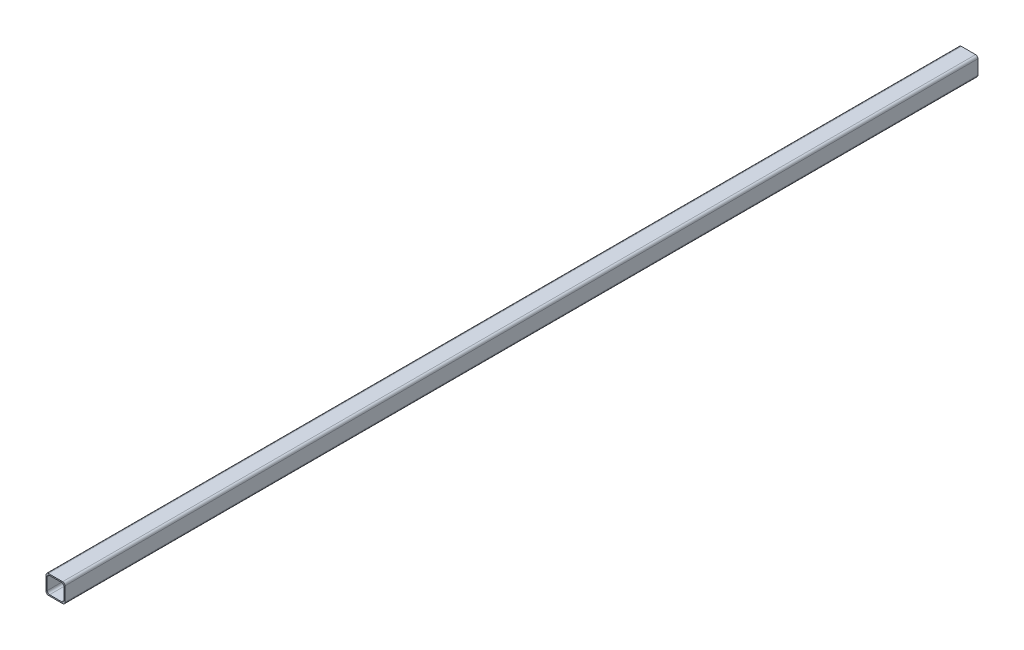
ISO-10303-21;
HEADER;
FILE_DESCRIPTION(('STEP AP214'),'2;1');
FILE_NAME('part.step','',(''),(''),'','','');
FILE_SCHEMA(('AUTOMOTIVE_DESIGN { 1 0 10303 214 1 1 1 1 }'));
ENDSEC;
DATA;
#1=APPLICATION_CONTEXT('core data for automotive mechanical design processes');
#2=APPLICATION_PROTOCOL_DEFINITION('international standard','automotive_design',2000,#1);
#3=PRODUCT_CONTEXT('',#1,'mechanical');
#4=PRODUCT('Part','Part','',(#3));
#5=PRODUCT_RELATED_PRODUCT_CATEGORY('part','',(#4));
#6=PRODUCT_DEFINITION_FORMATION('','',#4);
#7=PRODUCT_DEFINITION_CONTEXT('part definition',#1,'design');
#8=PRODUCT_DEFINITION('design','',#6,#7);
#9=PRODUCT_DEFINITION_SHAPE('','',#8);
#10=(LENGTH_UNIT() NAMED_UNIT(*) SI_UNIT(.MILLI.,.METRE.));
#11=(NAMED_UNIT(*) PLANE_ANGLE_UNIT() SI_UNIT($,.RADIAN.));
#12=(NAMED_UNIT(*) SI_UNIT($,.STERADIAN.) SOLID_ANGLE_UNIT());
#13=UNCERTAINTY_MEASURE_WITH_UNIT(LENGTH_MEASURE(1.E-05),#10,'distance_accuracy_value','');
#14=(GEOMETRIC_REPRESENTATION_CONTEXT(3) GLOBAL_UNCERTAINTY_ASSIGNED_CONTEXT((#13)) GLOBAL_UNIT_ASSIGNED_CONTEXT((#10,
#11,#12)) REPRESENTATION_CONTEXT('',''));
#15=CARTESIAN_POINT('',(0.,0.,0.));
#16=DIRECTION('',(0.,0.,1.));
#17=DIRECTION('',(1.,0.,0.));
#18=AXIS2_PLACEMENT_3D('',#15,#16,#17);
#19=CARTESIAN_POINT('',(0.,0.,609.6));
#20=DIRECTION('',(0.,0.,1.));
#21=DIRECTION('',(1.,0.,0.));
#22=AXIS2_PLACEMENT_3D('',#19,#20,#21);
#23=PLANE('',#22);
#24=DIRECTION('',(1.,0.,0.));
#25=VECTOR('',#24,1.);
#26=CARTESIAN_POINT('',(-12.7,-12.7,609.6));
#27=LINE('',#26,#25);
#28=CARTESIAN_POINT('',(-9.525,-12.7,609.6));
#29=VERTEX_POINT('',#28);
#30=CARTESIAN_POINT('',(9.525,-12.7,609.6));
#31=VERTEX_POINT('',#30);
#32=EDGE_CURVE('E172',#29,#31,#27,.T.);
#33=ORIENTED_EDGE('',*,*,#32,.T.);
#34=CARTESIAN_POINT('',(9.525,-9.525,609.6));
#35=DIRECTION('',(0.,0.,1.));
#36=DIRECTION('',(1.,0.,0.));
#37=AXIS2_PLACEMENT_3D('',#34,#35,#36);
#38=CIRCLE('',#37,3.175);
#39=CARTESIAN_POINT('',(12.7,-9.525,609.6));
#40=VERTEX_POINT('',#39);
#41=EDGE_CURVE('E215',#31,#40,#38,.T.);
#42=ORIENTED_EDGE('',*,*,#41,.T.);
#43=DIRECTION('',(0.,1.,0.));
#44=VECTOR('',#43,1.);
#45=CARTESIAN_POINT('',(12.7,12.7,609.6));
#46=LINE('',#45,#44);
#47=CARTESIAN_POINT('',(12.7,9.525,609.6));
#48=VERTEX_POINT('',#47);
#49=EDGE_CURVE('E264',#40,#48,#46,.T.);
#50=ORIENTED_EDGE('',*,*,#49,.T.);
#51=CARTESIAN_POINT('',(9.525,9.525,609.6));
#52=DIRECTION('',(0.,0.,1.));
#53=DIRECTION('',(1.,0.,0.));
#54=AXIS2_PLACEMENT_3D('',#51,#52,#53);
#55=CIRCLE('',#54,3.175);
#56=CARTESIAN_POINT('',(9.525,12.7,609.6));
#57=VERTEX_POINT('',#56);
#58=EDGE_CURVE('E209',#48,#57,#55,.T.);
#59=ORIENTED_EDGE('',*,*,#58,.T.);
#60=DIRECTION('',(-1.,0.,0.));
#61=VECTOR('',#60,1.);
#62=CARTESIAN_POINT('',(-12.7,12.7,609.6));
#63=LINE('',#62,#61);
#64=CARTESIAN_POINT('',(-9.525,12.7,609.6));
#65=VERTEX_POINT('',#64);
#66=EDGE_CURVE('E267',#57,#65,#63,.T.);
#67=ORIENTED_EDGE('',*,*,#66,.T.);
#68=CARTESIAN_POINT('',(-9.525,9.525,609.6));
#69=DIRECTION('',(0.,0.,1.));
#70=DIRECTION('',(1.,0.,0.));
#71=AXIS2_PLACEMENT_3D('',#68,#69,#70);
#72=CIRCLE('',#71,3.175);
#73=CARTESIAN_POINT('',(-12.7,9.525,609.6));
#74=VERTEX_POINT('',#73);
#75=EDGE_CURVE('E211',#65,#74,#72,.T.);
#76=ORIENTED_EDGE('',*,*,#75,.T.);
#77=DIRECTION('',(0.,-1.,0.));
#78=VECTOR('',#77,1.);
#79=CARTESIAN_POINT('',(-12.7,12.7,609.6));
#80=LINE('',#79,#78);
#81=CARTESIAN_POINT('',(-12.7,-9.525,609.6));
#82=VERTEX_POINT('',#81);
#83=EDGE_CURVE('E177',#74,#82,#80,.T.);
#84=ORIENTED_EDGE('',*,*,#83,.T.);
#85=CARTESIAN_POINT('',(-9.525,-9.525,609.6));
#86=DIRECTION('',(0.,0.,1.));
#87=DIRECTION('',(1.,0.,0.));
#88=AXIS2_PLACEMENT_3D('',#85,#86,#87);
#89=CIRCLE('',#88,3.175);
#90=EDGE_CURVE('E213',#82,#29,#89,.T.);
#91=ORIENTED_EDGE('',*,*,#90,.T.);
#92=EDGE_LOOP('',(#33,#42,#50,#59,#67,#76,#84,#91));
#93=FACE_BOUND('',#92,.T.);
#94=DIRECTION('',(-1.,0.,0.));
#95=VECTOR('',#94,1.);
#96=CARTESIAN_POINT('',(-11.1252,11.1252,609.6));
#97=LINE('',#96,#95);
#98=CARTESIAN_POINT('',(7.95019999999999,11.1252,609.6));
#99=VERTEX_POINT('',#98);
#100=CARTESIAN_POINT('',(-7.9502,11.1252,609.6));
#101=VERTEX_POINT('',#100);
#102=EDGE_CURVE('E249',#99,#101,#97,.T.);
#103=ORIENTED_EDGE('',*,*,#102,.F.);
#104=CARTESIAN_POINT('',(7.9502,7.9502,609.6));
#105=DIRECTION('',(0.,0.,1.));
#106=DIRECTION('',(1.,0.,0.));
#107=AXIS2_PLACEMENT_3D('',#104,#105,#106);
#108=CIRCLE('',#107,3.175);
#109=CARTESIAN_POINT('',(11.1252,7.9502,609.6));
#110=VERTEX_POINT('',#109);
#111=EDGE_CURVE('E237',#99,#110,#108,.F.);
#112=ORIENTED_EDGE('',*,*,#111,.T.);
#113=DIRECTION('',(0.,1.,0.));
#114=VECTOR('',#113,1.);
#115=CARTESIAN_POINT('',(11.1252,11.1252,609.6));
#116=LINE('',#115,#114);
#117=CARTESIAN_POINT('',(11.1252,-7.95019999999999,609.6));
#118=VERTEX_POINT('',#117);
#119=EDGE_CURVE('E168',#118,#110,#116,.T.);
#120=ORIENTED_EDGE('',*,*,#119,.F.);
#121=CARTESIAN_POINT('',(7.9502,-7.9502,609.6));
#122=DIRECTION('',(0.,0.,1.));
#123=DIRECTION('',(1.,0.,0.));
#124=AXIS2_PLACEMENT_3D('',#121,#122,#123);
#125=CIRCLE('',#124,3.175);
#126=CARTESIAN_POINT('',(7.9502,-11.1252,609.6));
#127=VERTEX_POINT('',#126);
#128=EDGE_CURVE('E158',#118,#127,#125,.F.);
#129=ORIENTED_EDGE('',*,*,#128,.T.);
#130=DIRECTION('',(1.,0.,0.));
#131=VECTOR('',#130,1.);
#132=CARTESIAN_POINT('',(-11.1252,-11.1252,609.6));
#133=LINE('',#132,#131);
#134=CARTESIAN_POINT('',(-7.9502,-11.1252,609.6));
#135=VERTEX_POINT('',#134);
#136=EDGE_CURVE('E253',#135,#127,#133,.T.);
#137=ORIENTED_EDGE('',*,*,#136,.F.);
#138=CARTESIAN_POINT('',(-7.9502,-7.9502,609.6));
#139=DIRECTION('',(0.,0.,1.));
#140=DIRECTION('',(1.,0.,0.));
#141=AXIS2_PLACEMENT_3D('',#138,#139,#140);
#142=CIRCLE('',#141,3.175);
#143=CARTESIAN_POINT('',(-11.1252,-7.95019999999999,609.6));
#144=VERTEX_POINT('',#143);
#145=EDGE_CURVE('E157',#135,#144,#142,.F.);
#146=ORIENTED_EDGE('',*,*,#145,.T.);
#147=DIRECTION('',(0.,-1.,0.));
#148=VECTOR('',#147,1.);
#149=CARTESIAN_POINT('',(-11.1252,11.1252,609.6));
#150=LINE('',#149,#148);
#151=CARTESIAN_POINT('',(-11.1252,7.9502,609.6));
#152=VERTEX_POINT('',#151);
#153=EDGE_CURVE('E251',#152,#144,#150,.T.);
#154=ORIENTED_EDGE('',*,*,#153,.F.);
#155=CARTESIAN_POINT('',(-7.9502,7.9502,609.6));
#156=DIRECTION('',(0.,0.,1.));
#157=DIRECTION('',(1.,0.,0.));
#158=AXIS2_PLACEMENT_3D('',#155,#156,#157);
#159=CIRCLE('',#158,3.175);
#160=EDGE_CURVE('E11',#152,#101,#159,.F.);
#161=ORIENTED_EDGE('',*,*,#160,.T.);
#162=EDGE_LOOP('',(#103,#112,#120,#129,#137,#146,#154,#161));
#163=FACE_BOUND('',#162,.T.);
#164=ADVANCED_FACE('F34',(#93,#163),#23,.T.);
#165=CARTESIAN_POINT('',(0.,0.,-609.6));
#166=DIRECTION('',(0.,0.,1.));
#167=DIRECTION('',(1.,0.,0.));
#168=AXIS2_PLACEMENT_3D('',#165,#166,#167);
#169=PLANE('',#168);
#170=DIRECTION('',(0.,1.,0.));
#171=VECTOR('',#170,1.);
#172=CARTESIAN_POINT('',(12.7,12.7,-609.6));
#173=LINE('',#172,#171);
#174=CARTESIAN_POINT('',(12.7,-9.525,-609.6));
#175=VERTEX_POINT('',#174);
#176=CARTESIAN_POINT('',(12.7,9.525,-609.6));
#177=VERTEX_POINT('',#176);
#178=EDGE_CURVE('E259',#175,#177,#173,.T.);
#179=ORIENTED_EDGE('',*,*,#178,.F.);
#180=CARTESIAN_POINT('',(9.525,-9.525,-609.6));
#181=DIRECTION('',(0.,0.,1.));
#182=DIRECTION('',(1.,0.,0.));
#183=AXIS2_PLACEMENT_3D('',#180,#181,#182);
#184=CIRCLE('',#183,3.175);
#185=CARTESIAN_POINT('',(9.525,-12.7,-609.6));
#186=VERTEX_POINT('',#185);
#187=EDGE_CURVE('E202',#175,#186,#184,.F.);
#188=ORIENTED_EDGE('',*,*,#187,.T.);
#189=DIRECTION('',(1.,0.,0.));
#190=VECTOR('',#189,1.);
#191=CARTESIAN_POINT('',(-12.7,-12.7,-609.6));
#192=LINE('',#191,#190);
#193=CARTESIAN_POINT('',(-9.525,-12.7,-609.6));
#194=VERTEX_POINT('',#193);
#195=EDGE_CURVE('E180',#194,#186,#192,.T.);
#196=ORIENTED_EDGE('',*,*,#195,.F.);
#197=CARTESIAN_POINT('',(-9.525,-9.525,-609.6));
#198=DIRECTION('',(0.,0.,1.));
#199=DIRECTION('',(1.,0.,0.));
#200=AXIS2_PLACEMENT_3D('',#197,#198,#199);
#201=CIRCLE('',#200,3.175);
#202=CARTESIAN_POINT('',(-12.7,-9.525,-609.6));
#203=VERTEX_POINT('',#202);
#204=EDGE_CURVE('E200',#194,#203,#201,.F.);
#205=ORIENTED_EDGE('',*,*,#204,.T.);
#206=DIRECTION('',(0.,-1.,0.));
#207=VECTOR('',#206,1.);
#208=CARTESIAN_POINT('',(-12.7,12.7,-609.6));
#209=LINE('',#208,#207);
#210=CARTESIAN_POINT('',(-12.7,9.525,-609.6));
#211=VERTEX_POINT('',#210);
#212=EDGE_CURVE('E276',#211,#203,#209,.T.);
#213=ORIENTED_EDGE('',*,*,#212,.F.);
#214=CARTESIAN_POINT('',(-9.525,9.525,-609.6));
#215=DIRECTION('',(0.,0.,1.));
#216=DIRECTION('',(1.,0.,0.));
#217=AXIS2_PLACEMENT_3D('',#214,#215,#216);
#218=CIRCLE('',#217,3.175);
#219=CARTESIAN_POINT('',(-9.525,12.7,-609.6));
#220=VERTEX_POINT('',#219);
#221=EDGE_CURVE('E198',#211,#220,#218,.F.);
#222=ORIENTED_EDGE('',*,*,#221,.T.);
#223=DIRECTION('',(-1.,0.,0.));
#224=VECTOR('',#223,1.);
#225=CARTESIAN_POINT('',(-12.7,12.7,-609.6));
#226=LINE('',#225,#224);
#227=CARTESIAN_POINT('',(9.525,12.7,-609.6));
#228=VERTEX_POINT('',#227);
#229=EDGE_CURVE('E274',#228,#220,#226,.T.);
#230=ORIENTED_EDGE('',*,*,#229,.F.);
#231=CARTESIAN_POINT('',(9.525,9.525,-609.6));
#232=DIRECTION('',(0.,0.,1.));
#233=DIRECTION('',(1.,0.,0.));
#234=AXIS2_PLACEMENT_3D('',#231,#232,#233);
#235=CIRCLE('',#234,3.175);
#236=EDGE_CURVE('E196',#228,#177,#235,.F.);
#237=ORIENTED_EDGE('',*,*,#236,.T.);
#238=EDGE_LOOP('',(#179,#188,#196,#205,#213,#222,#230,#237));
#239=FACE_BOUND('',#238,.T.);
#240=DIRECTION('',(1.,0.,0.));
#241=VECTOR('',#240,1.);
#242=CARTESIAN_POINT('',(-11.1252,-11.1252,-609.6));
#243=LINE('',#242,#241);
#244=CARTESIAN_POINT('',(-7.9502,-11.1252,-609.6));
#245=VERTEX_POINT('',#244);
#246=CARTESIAN_POINT('',(7.9502,-11.1252,-609.6));
#247=VERTEX_POINT('',#246);
#248=EDGE_CURVE('E150',#245,#247,#243,.T.);
#249=ORIENTED_EDGE('',*,*,#248,.T.);
#250=CARTESIAN_POINT('',(7.9502,-7.9502,-609.6));
#251=DIRECTION('',(0.,0.,1.));
#252=DIRECTION('',(1.,0.,0.));
#253=AXIS2_PLACEMENT_3D('',#250,#251,#252);
#254=CIRCLE('',#253,3.175);
#255=CARTESIAN_POINT('',(11.1252,-7.95019999999999,-609.6));
#256=VERTEX_POINT('',#255);
#257=EDGE_CURVE('E231',#247,#256,#254,.T.);
#258=ORIENTED_EDGE('',*,*,#257,.T.);
#259=DIRECTION('',(0.,1.,0.));
#260=VECTOR('',#259,1.);
#261=CARTESIAN_POINT('',(11.1252,11.1252,-609.6));
#262=LINE('',#261,#260);
#263=CARTESIAN_POINT('',(11.1252,7.9502,-609.6));
#264=VERTEX_POINT('',#263);
#265=EDGE_CURVE('E260',#256,#264,#262,.T.);
#266=ORIENTED_EDGE('',*,*,#265,.T.);
#267=CARTESIAN_POINT('',(7.9502,7.9502,-609.6));
#268=DIRECTION('',(0.,0.,1.));
#269=DIRECTION('',(1.,0.,0.));
#270=AXIS2_PLACEMENT_3D('',#267,#268,#269);
#271=CIRCLE('',#270,3.175);
#272=CARTESIAN_POINT('',(7.95019999999999,11.1252,-609.6));
#273=VERTEX_POINT('',#272);
#274=EDGE_CURVE('E235',#264,#273,#271,.T.);
#275=ORIENTED_EDGE('',*,*,#274,.T.);
#276=DIRECTION('',(-1.,0.,0.));
#277=VECTOR('',#276,1.);
#278=CARTESIAN_POINT('',(-11.1252,11.1252,-609.6));
#279=LINE('',#278,#277);
#280=CARTESIAN_POINT('',(-7.9502,11.1252,-609.6));
#281=VERTEX_POINT('',#280);
#282=EDGE_CURVE('E239',#273,#281,#279,.T.);
#283=ORIENTED_EDGE('',*,*,#282,.T.);
#284=CARTESIAN_POINT('',(-7.9502,7.9502,-609.6));
#285=DIRECTION('',(0.,0.,1.));
#286=DIRECTION('',(1.,0.,0.));
#287=AXIS2_PLACEMENT_3D('',#284,#285,#286);
#288=CIRCLE('',#287,3.175);
#289=CARTESIAN_POINT('',(-11.1252,7.9502,-609.6));
#290=VERTEX_POINT('',#289);
#291=EDGE_CURVE('E42',#281,#290,#288,.T.);
#292=ORIENTED_EDGE('',*,*,#291,.T.);
#293=DIRECTION('',(0.,-1.,0.));
#294=VECTOR('',#293,1.);
#295=CARTESIAN_POINT('',(-11.1252,11.1252,-609.6));
#296=LINE('',#295,#294);
#297=CARTESIAN_POINT('',(-11.1252,-7.95019999999999,-609.6));
#298=VERTEX_POINT('',#297);
#299=EDGE_CURVE('E152',#290,#298,#296,.T.);
#300=ORIENTED_EDGE('',*,*,#299,.T.);
#301=CARTESIAN_POINT('',(-7.9502,-7.9502,-609.6));
#302=DIRECTION('',(0.,0.,1.));
#303=DIRECTION('',(1.,0.,0.));
#304=AXIS2_PLACEMENT_3D('',#301,#302,#303);
#305=CIRCLE('',#304,3.175);
#306=EDGE_CURVE('E147',#298,#245,#305,.T.);
#307=ORIENTED_EDGE('',*,*,#306,.T.);
#308=EDGE_LOOP('',(#249,#258,#266,#275,#283,#292,#300,#307));
#309=FACE_BOUND('',#308,.T.);
#310=ADVANCED_FACE('F149',(#239,#309),#169,.F.);
#311=CARTESIAN_POINT('',(12.7,12.7,609.6));
#312=DIRECTION('',(-1.,0.,0.));
#313=DIRECTION('',(0.,-1.,0.));
#314=AXIS2_PLACEMENT_3D('',#311,#312,#313);
#315=PLANE('',#314);
#316=ORIENTED_EDGE('',*,*,#49,.F.);
#317=DIRECTION('',(0.,0.,-1.));
#318=VECTOR('',#317,1.);
#319=CARTESIAN_POINT('',(12.7,-9.525,609.6));
#320=LINE('',#319,#318);
#321=EDGE_CURVE('E193',#40,#175,#320,.T.);
#322=ORIENTED_EDGE('',*,*,#321,.T.);
#323=ORIENTED_EDGE('',*,*,#178,.T.);
#324=DIRECTION('',(0.,0.,-1.));
#325=VECTOR('',#324,1.);
#326=CARTESIAN_POINT('',(12.7,9.525,609.6));
#327=LINE('',#326,#325);
#328=EDGE_CURVE('E191',#177,#48,#327,.F.);
#329=ORIENTED_EDGE('',*,*,#328,.T.);
#330=EDGE_LOOP('',(#316,#322,#323,#329));
#331=FACE_BOUND('',#330,.T.);
#332=ADVANCED_FACE('F297',(#331),#315,.F.);
#333=CARTESIAN_POINT('',(-12.7,12.7,609.6));
#334=DIRECTION('',(0.,-1.,0.));
#335=DIRECTION('',(0.,0.,-1.));
#336=AXIS2_PLACEMENT_3D('',#333,#334,#335);
#337=PLANE('',#336);
#338=ORIENTED_EDGE('',*,*,#229,.T.);
#339=DIRECTION('',(0.,0.,-1.));
#340=VECTOR('',#339,1.);
#341=CARTESIAN_POINT('',(-9.525,12.7,609.6));
#342=LINE('',#341,#340);
#343=EDGE_CURVE('E229',#220,#65,#342,.F.);
#344=ORIENTED_EDGE('',*,*,#343,.T.);
#345=ORIENTED_EDGE('',*,*,#66,.F.);
#346=DIRECTION('',(0.,0.,-1.));
#347=VECTOR('',#346,1.);
#348=CARTESIAN_POINT('',(9.525,12.7,609.6));
#349=LINE('',#348,#347);
#350=EDGE_CURVE('E226',#57,#228,#349,.T.);
#351=ORIENTED_EDGE('',*,*,#350,.T.);
#352=EDGE_LOOP('',(#338,#344,#345,#351));
#353=FACE_BOUND('',#352,.T.);
#354=ADVANCED_FACE('F305',(#353),#337,.F.);
#355=CARTESIAN_POINT('',(-12.7,12.7,609.6));
#356=DIRECTION('',(1.,0.,0.));
#357=DIRECTION('',(0.,1.,0.));
#358=AXIS2_PLACEMENT_3D('',#355,#356,#357);
#359=PLANE('',#358);
#360=ORIENTED_EDGE('',*,*,#212,.T.);
#361=DIRECTION('',(0.,0.,-1.));
#362=VECTOR('',#361,1.);
#363=CARTESIAN_POINT('',(-12.7,-9.525,609.6));
#364=LINE('',#363,#362);
#365=EDGE_CURVE('E220',#203,#82,#364,.F.);
#366=ORIENTED_EDGE('',*,*,#365,.T.);
#367=ORIENTED_EDGE('',*,*,#83,.F.);
#368=DIRECTION('',(0.,0.,-1.));
#369=VECTOR('',#368,1.);
#370=CARTESIAN_POINT('',(-12.7,9.525,609.6));
#371=LINE('',#370,#369);
#372=EDGE_CURVE('E217',#74,#211,#371,.T.);
#373=ORIENTED_EDGE('',*,*,#372,.T.);
#374=EDGE_LOOP('',(#360,#366,#367,#373));
#375=FACE_BOUND('',#374,.T.);
#376=ADVANCED_FACE('F313',(#375),#359,.F.);
#377=CARTESIAN_POINT('',(-12.7,-12.7,609.6));
#378=DIRECTION('',(0.,1.,0.));
#379=DIRECTION('',(0.,0.,1.));
#380=AXIS2_PLACEMENT_3D('',#377,#378,#379);
#381=PLANE('',#380);
#382=ORIENTED_EDGE('',*,*,#195,.T.);
#383=DIRECTION('',(0.,0.,-1.));
#384=VECTOR('',#383,1.);
#385=CARTESIAN_POINT('',(9.525,-12.7,609.6));
#386=LINE('',#385,#384);
#387=EDGE_CURVE('E207',#186,#31,#386,.F.);
#388=ORIENTED_EDGE('',*,*,#387,.T.);
#389=ORIENTED_EDGE('',*,*,#32,.F.);
#390=DIRECTION('',(0.,0.,-1.));
#391=VECTOR('',#390,1.);
#392=CARTESIAN_POINT('',(-9.525,-12.7,609.6));
#393=LINE('',#392,#391);
#394=EDGE_CURVE('E204',#29,#194,#393,.T.);
#395=ORIENTED_EDGE('',*,*,#394,.T.);
#396=EDGE_LOOP('',(#382,#388,#389,#395));
#397=FACE_BOUND('',#396,.T.);
#398=ADVANCED_FACE('F285',(#397),#381,.F.);
#399=CARTESIAN_POINT('',(11.1252,11.1252,609.6));
#400=DIRECTION('',(-1.,0.,0.));
#401=DIRECTION('',(0.,-1.,0.));
#402=AXIS2_PLACEMENT_3D('',#399,#400,#401);
#403=PLANE('',#402);
#404=ORIENTED_EDGE('',*,*,#265,.F.);
#405=DIRECTION('',(0.,0.,-1.));
#406=VECTOR('',#405,1.);
#407=CARTESIAN_POINT('',(11.1252,-7.9502,609.6));
#408=LINE('',#407,#406);
#409=EDGE_CURVE('E185',#256,#118,#408,.F.);
#410=ORIENTED_EDGE('',*,*,#409,.T.);
#411=ORIENTED_EDGE('',*,*,#119,.T.);
#412=DIRECTION('',(0.,0.,-1.));
#413=VECTOR('',#412,1.);
#414=CARTESIAN_POINT('',(11.1252,7.9502,-609.6));
#415=LINE('',#414,#413);
#416=EDGE_CURVE('E174',#110,#264,#415,.T.);
#417=ORIENTED_EDGE('',*,*,#416,.T.);
#418=EDGE_LOOP('',(#404,#410,#411,#417));
#419=FACE_BOUND('',#418,.T.);
#420=ADVANCED_FACE('F328',(#419),#403,.T.);
#421=CARTESIAN_POINT('',(-11.1252,11.1252,609.6));
#422=DIRECTION('',(0.,-1.,0.));
#423=DIRECTION('',(0.,0.,-1.));
#424=AXIS2_PLACEMENT_3D('',#421,#422,#423);
#425=PLANE('',#424);
#426=ORIENTED_EDGE('',*,*,#282,.F.);
#427=DIRECTION('',(0.,0.,-1.));
#428=VECTOR('',#427,1.);
#429=CARTESIAN_POINT('',(7.9502,11.1252,609.6));
#430=LINE('',#429,#428);
#431=EDGE_CURVE('E54',#273,#99,#430,.F.);
#432=ORIENTED_EDGE('',*,*,#431,.T.);
#433=ORIENTED_EDGE('',*,*,#102,.T.);
#434=DIRECTION('',(0.,0.,-1.));
#435=VECTOR('',#434,1.);
#436=CARTESIAN_POINT('',(-7.9502,11.1252,-609.6));
#437=LINE('',#436,#435);
#438=EDGE_CURVE('E222',#101,#281,#437,.T.);
#439=ORIENTED_EDGE('',*,*,#438,.T.);
#440=EDGE_LOOP('',(#426,#432,#433,#439));
#441=FACE_BOUND('',#440,.T.);
#442=ADVANCED_FACE('F248',(#441),#425,.T.);
#443=CARTESIAN_POINT('',(-11.1252,11.1252,609.6));
#444=DIRECTION('',(1.,0.,0.));
#445=DIRECTION('',(0.,0.,-1.));
#446=AXIS2_PLACEMENT_3D('',#443,#444,#445);
#447=PLANE('',#446);
#448=ORIENTED_EDGE('',*,*,#153,.T.);
#449=DIRECTION('',(0.,0.,-1.));
#450=VECTOR('',#449,1.);
#451=CARTESIAN_POINT('',(-11.1252,-7.9502,-609.6));
#452=LINE('',#451,#450);
#453=EDGE_CURVE('E189',#144,#298,#452,.T.);
#454=ORIENTED_EDGE('',*,*,#453,.T.);
#455=ORIENTED_EDGE('',*,*,#299,.F.);
#456=DIRECTION('',(0.,0.,-1.));
#457=VECTOR('',#456,1.);
#458=CARTESIAN_POINT('',(-11.1252,7.9502,609.6));
#459=LINE('',#458,#457);
#460=EDGE_CURVE('E187',#290,#152,#459,.F.);
#461=ORIENTED_EDGE('',*,*,#460,.T.);
#462=EDGE_LOOP('',(#448,#454,#455,#461));
#463=FACE_BOUND('',#462,.T.);
#464=ADVANCED_FACE('F245',(#463),#447,.T.);
#465=CARTESIAN_POINT('',(-11.1252,-11.1252,609.6));
#466=DIRECTION('',(0.,1.,0.));
#467=DIRECTION('',(0.,0.,1.));
#468=AXIS2_PLACEMENT_3D('',#465,#466,#467);
#469=PLANE('',#468);
#470=ORIENTED_EDGE('',*,*,#136,.T.);
#471=DIRECTION('',(0.,0.,-1.));
#472=VECTOR('',#471,1.);
#473=CARTESIAN_POINT('',(7.9502,-11.1252,-609.6));
#474=LINE('',#473,#472);
#475=EDGE_CURVE('E167',#127,#247,#474,.T.);
#476=ORIENTED_EDGE('',*,*,#475,.T.);
#477=ORIENTED_EDGE('',*,*,#248,.F.);
#478=DIRECTION('',(0.,0.,-1.));
#479=VECTOR('',#478,1.);
#480=CARTESIAN_POINT('',(-7.9502,-11.1252,609.6));
#481=LINE('',#480,#479);
#482=EDGE_CURVE('E164',#245,#135,#481,.F.);
#483=ORIENTED_EDGE('',*,*,#482,.T.);
#484=EDGE_LOOP('',(#470,#476,#477,#483));
#485=FACE_BOUND('',#484,.T.);
#486=ADVANCED_FACE('F163',(#485),#469,.T.);
#487=CARTESIAN_POINT('',(7.9502,-7.9502,609.6));
#488=DIRECTION('',(0.,0.,1.));
#489=DIRECTION('',(1.,0.,0.));
#490=AXIS2_PLACEMENT_3D('',#487,#488,#489);
#491=CYLINDRICAL_SURFACE('',#490,3.175);
#492=ORIENTED_EDGE('',*,*,#128,.F.);
#493=ORIENTED_EDGE('',*,*,#409,.F.);
#494=ORIENTED_EDGE('',*,*,#257,.F.);
#495=ORIENTED_EDGE('',*,*,#475,.F.);
#496=EDGE_LOOP('',(#492,#493,#494,#495));
#497=FACE_BOUND('',#496,.T.);
#498=ADVANCED_FACE('F333',(#497),#491,.F.);
#499=CARTESIAN_POINT('',(-7.9502,-7.9502,609.6));
#500=DIRECTION('',(0.,0.,1.));
#501=DIRECTION('',(1.,0.,0.));
#502=AXIS2_PLACEMENT_3D('',#499,#500,#501);
#503=CYLINDRICAL_SURFACE('',#502,3.175);
#504=ORIENTED_EDGE('',*,*,#145,.F.);
#505=ORIENTED_EDGE('',*,*,#482,.F.);
#506=ORIENTED_EDGE('',*,*,#306,.F.);
#507=ORIENTED_EDGE('',*,*,#453,.F.);
#508=EDGE_LOOP('',(#504,#505,#506,#507));
#509=FACE_BOUND('',#508,.T.);
#510=ADVANCED_FACE('F171',(#509),#503,.F.);
#511=CARTESIAN_POINT('',(9.525,-9.525,609.6));
#512=DIRECTION('',(0.,0.,-1.));
#513=DIRECTION('',(-1.,0.,0.));
#514=AXIS2_PLACEMENT_3D('',#511,#512,#513);
#515=CYLINDRICAL_SURFACE('',#514,3.175);
#516=ORIENTED_EDGE('',*,*,#41,.F.);
#517=ORIENTED_EDGE('',*,*,#387,.F.);
#518=ORIENTED_EDGE('',*,*,#187,.F.);
#519=ORIENTED_EDGE('',*,*,#321,.F.);
#520=EDGE_LOOP('',(#516,#517,#518,#519));
#521=FACE_BOUND('',#520,.T.);
#522=ADVANCED_FACE('F291',(#521),#515,.T.);
#523=CARTESIAN_POINT('',(-9.525,-9.525,609.6));
#524=DIRECTION('',(0.,0.,-1.));
#525=DIRECTION('',(-1.,0.,0.));
#526=AXIS2_PLACEMENT_3D('',#523,#524,#525);
#527=CYLINDRICAL_SURFACE('',#526,3.175);
#528=ORIENTED_EDGE('',*,*,#90,.F.);
#529=ORIENTED_EDGE('',*,*,#365,.F.);
#530=ORIENTED_EDGE('',*,*,#204,.F.);
#531=ORIENTED_EDGE('',*,*,#394,.F.);
#532=EDGE_LOOP('',(#528,#529,#530,#531));
#533=FACE_BOUND('',#532,.T.);
#534=ADVANCED_FACE('F315',(#533),#527,.T.);
#535=CARTESIAN_POINT('',(7.9502,7.9502,609.6));
#536=DIRECTION('',(0.,0.,1.));
#537=DIRECTION('',(1.,0.,0.));
#538=AXIS2_PLACEMENT_3D('',#535,#536,#537);
#539=CYLINDRICAL_SURFACE('',#538,3.175);
#540=ORIENTED_EDGE('',*,*,#111,.F.);
#541=ORIENTED_EDGE('',*,*,#431,.F.);
#542=ORIENTED_EDGE('',*,*,#274,.F.);
#543=ORIENTED_EDGE('',*,*,#416,.F.);
#544=EDGE_LOOP('',(#540,#541,#542,#543));
#545=FACE_BOUND('',#544,.T.);
#546=ADVANCED_FACE('F343',(#545),#539,.F.);
#547=CARTESIAN_POINT('',(-7.9502,7.9502,609.6));
#548=DIRECTION('',(0.,0.,1.));
#549=DIRECTION('',(1.,0.,0.));
#550=AXIS2_PLACEMENT_3D('',#547,#548,#549);
#551=CYLINDRICAL_SURFACE('',#550,3.175);
#552=ORIENTED_EDGE('',*,*,#160,.F.);
#553=ORIENTED_EDGE('',*,*,#460,.F.);
#554=ORIENTED_EDGE('',*,*,#291,.F.);
#555=ORIENTED_EDGE('',*,*,#438,.F.);
#556=EDGE_LOOP('',(#552,#553,#554,#555));
#557=FACE_BOUND('',#556,.T.);
#558=ADVANCED_FACE('F247',(#557),#551,.F.);
#559=CARTESIAN_POINT('',(-9.525,9.525,609.6));
#560=DIRECTION('',(0.,0.,-1.));
#561=DIRECTION('',(-1.,0.,0.));
#562=AXIS2_PLACEMENT_3D('',#559,#560,#561);
#563=CYLINDRICAL_SURFACE('',#562,3.175);
#564=ORIENTED_EDGE('',*,*,#75,.F.);
#565=ORIENTED_EDGE('',*,*,#343,.F.);
#566=ORIENTED_EDGE('',*,*,#221,.F.);
#567=ORIENTED_EDGE('',*,*,#372,.F.);
#568=EDGE_LOOP('',(#564,#565,#566,#567));
#569=FACE_BOUND('',#568,.T.);
#570=ADVANCED_FACE('F309',(#569),#563,.T.);
#571=CARTESIAN_POINT('',(9.525,9.525,609.6));
#572=DIRECTION('',(0.,0.,-1.));
#573=DIRECTION('',(-1.,0.,0.));
#574=AXIS2_PLACEMENT_3D('',#571,#572,#573);
#575=CYLINDRICAL_SURFACE('',#574,3.175);
#576=ORIENTED_EDGE('',*,*,#58,.F.);
#577=ORIENTED_EDGE('',*,*,#328,.F.);
#578=ORIENTED_EDGE('',*,*,#236,.F.);
#579=ORIENTED_EDGE('',*,*,#350,.F.);
#580=EDGE_LOOP('',(#576,#577,#578,#579));
#581=FACE_BOUND('',#580,.T.);
#582=ADVANCED_FACE('F36',(#581),#575,.T.);
#583=CLOSED_SHELL('',(#164,#310,#332,#354,#376,#398,#420,#442,#464,#486,#498,#510,#522,#534,
#546,#558,#570,#582));
#584=MANIFOLD_SOLID_BREP('B2',#583);
#585=ADVANCED_BREP_SHAPE_REPRESENTATION('',(#18,#584),#14);
#586=SHAPE_DEFINITION_REPRESENTATION(#9,#585);
ENDSEC;
END-ISO-10303-21;
